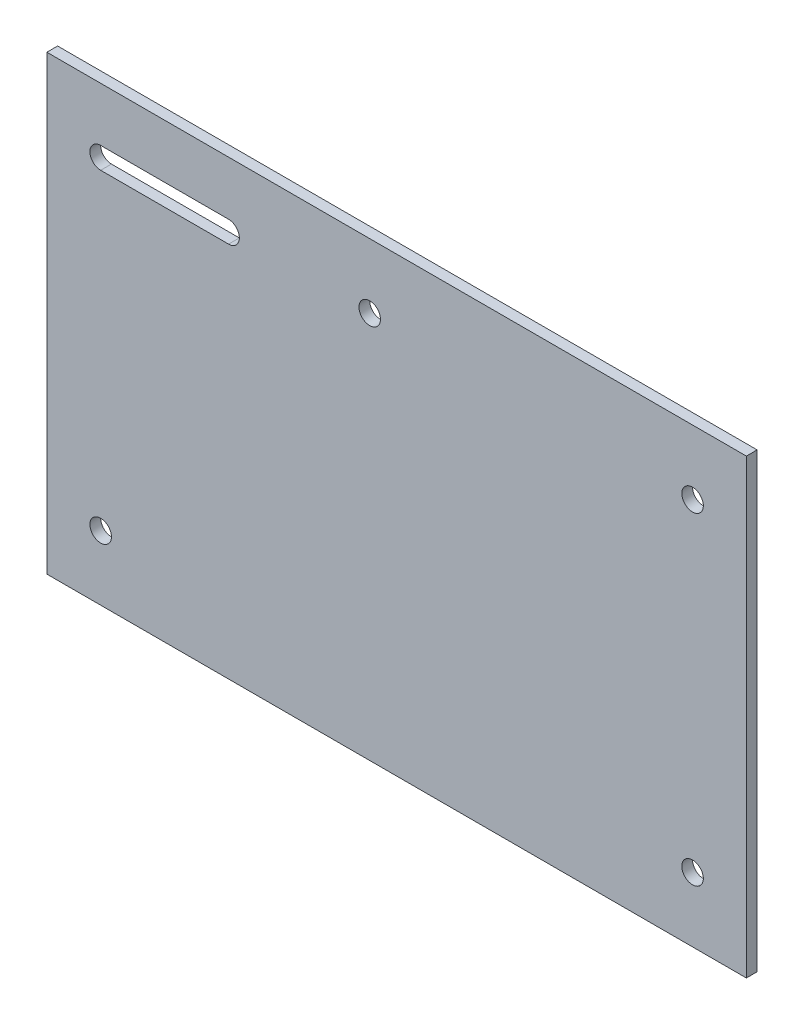
ISO-10303-21;
HEADER;
FILE_DESCRIPTION(('STEP AP214'),'2;1');
FILE_NAME('part.step','',(''),(''),'','','');
FILE_SCHEMA(('AUTOMOTIVE_DESIGN { 1 0 10303 214 1 1 1 1 }'));
ENDSEC;
DATA;
#1=APPLICATION_CONTEXT('core data for automotive mechanical design processes');
#2=APPLICATION_PROTOCOL_DEFINITION('international standard','automotive_design',2000,#1);
#3=PRODUCT_CONTEXT('',#1,'mechanical');
#4=PRODUCT('Part','Part','',(#3));
#5=PRODUCT_RELATED_PRODUCT_CATEGORY('part','',(#4));
#6=PRODUCT_DEFINITION_FORMATION('','',#4);
#7=PRODUCT_DEFINITION_CONTEXT('part definition',#1,'design');
#8=PRODUCT_DEFINITION('design','',#6,#7);
#9=PRODUCT_DEFINITION_SHAPE('','',#8);
#10=(LENGTH_UNIT() NAMED_UNIT(*) SI_UNIT(.MILLI.,.METRE.));
#11=(NAMED_UNIT(*) PLANE_ANGLE_UNIT() SI_UNIT($,.RADIAN.));
#12=(NAMED_UNIT(*) SI_UNIT($,.STERADIAN.) SOLID_ANGLE_UNIT());
#13=UNCERTAINTY_MEASURE_WITH_UNIT(LENGTH_MEASURE(1.E-05),#10,'distance_accuracy_value','');
#14=(GEOMETRIC_REPRESENTATION_CONTEXT(3) GLOBAL_UNCERTAINTY_ASSIGNED_CONTEXT((#13)) GLOBAL_UNIT_ASSIGNED_CONTEXT((#10,
#11,#12)) REPRESENTATION_CONTEXT('',''));
#15=CARTESIAN_POINT('',(0.,0.,0.));
#16=DIRECTION('',(0.,0.,1.));
#17=DIRECTION('',(1.,0.,0.));
#18=AXIS2_PLACEMENT_3D('',#15,#16,#17);
#19=CARTESIAN_POINT('',(65.,-42.,2.));
#20=DIRECTION('',(-1.,0.,0.));
#21=DIRECTION('',(0.,0.,1.));
#22=AXIS2_PLACEMENT_3D('',#19,#20,#21);
#23=PLANE('',#22);
#24=DIRECTION('',(0.,1.,0.));
#25=VECTOR('',#24,1.);
#26=CARTESIAN_POINT('',(65.,-42.,0.));
#27=LINE('',#26,#25);
#28=CARTESIAN_POINT('',(65.,-42.,0.));
#29=VERTEX_POINT('',#28);
#30=CARTESIAN_POINT('',(65.,42.,0.));
#31=VERTEX_POINT('',#30);
#32=EDGE_CURVE('E156',#29,#31,#27,.T.);
#33=ORIENTED_EDGE('',*,*,#32,.T.);
#34=DIRECTION('',(0.,0.,-1.));
#35=VECTOR('',#34,1.);
#36=CARTESIAN_POINT('',(65.,42.,2.));
#37=LINE('',#36,#35);
#38=CARTESIAN_POINT('',(65.,42.,2.));
#39=VERTEX_POINT('',#38);
#40=EDGE_CURVE('E11',#39,#31,#37,.T.);
#41=ORIENTED_EDGE('',*,*,#40,.F.);
#42=DIRECTION('',(0.,1.,0.));
#43=VECTOR('',#42,1.);
#44=CARTESIAN_POINT('',(65.,-42.,2.));
#45=LINE('',#44,#43);
#46=CARTESIAN_POINT('',(65.,-42.,2.));
#47=VERTEX_POINT('',#46);
#48=EDGE_CURVE('E159',#47,#39,#45,.T.);
#49=ORIENTED_EDGE('',*,*,#48,.F.);
#50=DIRECTION('',(0.,0.,-1.));
#51=VECTOR('',#50,1.);
#52=CARTESIAN_POINT('',(65.,-42.,2.));
#53=LINE('',#52,#51);
#54=EDGE_CURVE('E169',#47,#29,#53,.T.);
#55=ORIENTED_EDGE('',*,*,#54,.T.);
#56=EDGE_LOOP('',(#33,#41,#49,#55));
#57=FACE_BOUND('',#56,.T.);
#58=ADVANCED_FACE('F34',(#57),#23,.F.);
#59=CARTESIAN_POINT('',(-65.,42.,2.));
#60=DIRECTION('',(0.,-1.,0.));
#61=DIRECTION('',(0.,0.,-1.));
#62=AXIS2_PLACEMENT_3D('',#59,#60,#61);
#63=PLANE('',#62);
#64=DIRECTION('',(-1.,0.,0.));
#65=VECTOR('',#64,1.);
#66=CARTESIAN_POINT('',(-65.,42.,0.));
#67=LINE('',#66,#65);
#68=CARTESIAN_POINT('',(-65.,42.,0.));
#69=VERTEX_POINT('',#68);
#70=EDGE_CURVE('E172',#31,#69,#67,.T.);
#71=ORIENTED_EDGE('',*,*,#70,.T.);
#72=DIRECTION('',(0.,0.,-1.));
#73=VECTOR('',#72,1.);
#74=CARTESIAN_POINT('',(-65.,42.,2.));
#75=LINE('',#74,#73);
#76=CARTESIAN_POINT('',(-65.,42.,2.));
#77=VERTEX_POINT('',#76);
#78=EDGE_CURVE('E41',#77,#69,#75,.T.);
#79=ORIENTED_EDGE('',*,*,#78,.F.);
#80=DIRECTION('',(-1.,0.,0.));
#81=VECTOR('',#80,1.);
#82=CARTESIAN_POINT('',(-65.,42.,2.));
#83=LINE('',#82,#81);
#84=EDGE_CURVE('E162',#39,#77,#83,.T.);
#85=ORIENTED_EDGE('',*,*,#84,.F.);
#86=ORIENTED_EDGE('',*,*,#40,.T.);
#87=EDGE_LOOP('',(#71,#79,#85,#86));
#88=FACE_BOUND('',#87,.T.);
#89=ADVANCED_FACE('F201',(#88),#63,.F.);
#90=CARTESIAN_POINT('',(-65.,-42.,2.));
#91=DIRECTION('',(1.,0.,0.));
#92=DIRECTION('',(0.,0.,-1.));
#93=AXIS2_PLACEMENT_3D('',#90,#91,#92);
#94=PLANE('',#93);
#95=DIRECTION('',(0.,-1.,0.));
#96=VECTOR('',#95,1.);
#97=CARTESIAN_POINT('',(-65.,-42.,0.));
#98=LINE('',#97,#96);
#99=CARTESIAN_POINT('',(-65.,-42.,0.));
#100=VERTEX_POINT('',#99);
#101=EDGE_CURVE('E174',#69,#100,#98,.T.);
#102=ORIENTED_EDGE('',*,*,#101,.T.);
#103=DIRECTION('',(0.,0.,-1.));
#104=VECTOR('',#103,1.);
#105=CARTESIAN_POINT('',(-65.,-42.,2.));
#106=LINE('',#105,#104);
#107=CARTESIAN_POINT('',(-65.,-42.,2.));
#108=VERTEX_POINT('',#107);
#109=EDGE_CURVE('E179',#108,#100,#106,.T.);
#110=ORIENTED_EDGE('',*,*,#109,.F.);
#111=DIRECTION('',(0.,-1.,0.));
#112=VECTOR('',#111,1.);
#113=CARTESIAN_POINT('',(-65.,-42.,2.));
#114=LINE('',#113,#112);
#115=EDGE_CURVE('E165',#77,#108,#114,.T.);
#116=ORIENTED_EDGE('',*,*,#115,.F.);
#117=ORIENTED_EDGE('',*,*,#78,.T.);
#118=EDGE_LOOP('',(#102,#110,#116,#117));
#119=FACE_BOUND('',#118,.T.);
#120=ADVANCED_FACE('F186',(#119),#94,.F.);
#121=CARTESIAN_POINT('',(-65.,-42.,2.));
#122=DIRECTION('',(0.,1.,0.));
#123=DIRECTION('',(0.,0.,1.));
#124=AXIS2_PLACEMENT_3D('',#121,#122,#123);
#125=PLANE('',#124);
#126=DIRECTION('',(1.,0.,0.));
#127=VECTOR('',#126,1.);
#128=CARTESIAN_POINT('',(-65.,-42.,0.));
#129=LINE('',#128,#127);
#130=EDGE_CURVE('E163',#100,#29,#129,.T.);
#131=ORIENTED_EDGE('',*,*,#130,.T.);
#132=ORIENTED_EDGE('',*,*,#54,.F.);
#133=DIRECTION('',(1.,0.,0.));
#134=VECTOR('',#133,1.);
#135=CARTESIAN_POINT('',(-65.,-42.,2.));
#136=LINE('',#135,#134);
#137=EDGE_CURVE('E167',#108,#47,#136,.T.);
#138=ORIENTED_EDGE('',*,*,#137,.F.);
#139=ORIENTED_EDGE('',*,*,#109,.T.);
#140=EDGE_LOOP('',(#131,#132,#138,#139));
#141=FACE_BOUND('',#140,.T.);
#142=ADVANCED_FACE('F194',(#141),#125,.F.);
#143=CARTESIAN_POINT('',(0.,0.,2.));
#144=DIRECTION('',(0.,0.,-1.));
#145=DIRECTION('',(-1.,0.,0.));
#146=AXIS2_PLACEMENT_3D('',#143,#144,#145);
#147=PLANE('',#146);
#148=DIRECTION('',(1.,0.,0.));
#149=VECTOR('',#148,1.);
#150=CARTESIAN_POINT('',(-55.,28.,2.));
#151=LINE('',#150,#149);
#152=CARTESIAN_POINT('',(-55.,28.,2.));
#153=VERTEX_POINT('',#152);
#154=CARTESIAN_POINT('',(-31.229864945392,28.,2.));
#155=VERTEX_POINT('',#154);
#156=EDGE_CURVE('E125',#153,#155,#151,.T.);
#157=ORIENTED_EDGE('',*,*,#156,.F.);
#158=CARTESIAN_POINT('',(-55.,30.,2.));
#159=DIRECTION('',(0.,0.,1.));
#160=DIRECTION('',(1.,0.,0.));
#161=AXIS2_PLACEMENT_3D('',#158,#159,#160);
#162=CIRCLE('',#161,2.);
#163=CARTESIAN_POINT('',(-55.,32.,2.));
#164=VERTEX_POINT('',#163);
#165=EDGE_CURVE('E48',#164,#153,#162,.T.);
#166=ORIENTED_EDGE('',*,*,#165,.F.);
#167=DIRECTION('',(-1.,0.,0.));
#168=VECTOR('',#167,1.);
#169=CARTESIAN_POINT('',(-55.,32.,2.));
#170=LINE('',#169,#168);
#171=CARTESIAN_POINT('',(-31.229864945392,32.,2.));
#172=VERTEX_POINT('',#171);
#173=EDGE_CURVE('E116',#172,#164,#170,.T.);
#174=ORIENTED_EDGE('',*,*,#173,.F.);
#175=CARTESIAN_POINT('',(-31.229864945392,30.,2.));
#176=DIRECTION('',(0.,0.,1.));
#177=DIRECTION('',(1.,0.,0.));
#178=AXIS2_PLACEMENT_3D('',#175,#176,#177);
#179=CIRCLE('',#178,2.);
#180=EDGE_CURVE('E119',#155,#172,#179,.T.);
#181=ORIENTED_EDGE('',*,*,#180,.F.);
#182=EDGE_LOOP('',(#157,#166,#174,#181));
#183=FACE_BOUND('',#182,.T.);
#184=CARTESIAN_POINT('',(-55.,-30.,2.));
#185=DIRECTION('',(0.,0.,1.));
#186=DIRECTION('',(1.,0.,0.));
#187=AXIS2_PLACEMENT_3D('',#184,#185,#186);
#188=CIRCLE('',#187,2.);
#189=CARTESIAN_POINT('',(-53.,-30.,2.));
#190=VERTEX_POINT('',#189);
#191=EDGE_CURVE('E145',#190,#190,#188,.T.);
#192=ORIENTED_EDGE('',*,*,#191,.F.);
#193=EDGE_LOOP('',(#192));
#194=FACE_BOUND('',#193,.T.);
#195=CARTESIAN_POINT('',(55.,30.,2.));
#196=DIRECTION('',(0.,0.,1.));
#197=DIRECTION('',(1.,0.,0.));
#198=AXIS2_PLACEMENT_3D('',#195,#196,#197);
#199=CIRCLE('',#198,2.);
#200=CARTESIAN_POINT('',(57.,30.,2.));
#201=VERTEX_POINT('',#200);
#202=EDGE_CURVE('E138',#201,#201,#199,.T.);
#203=ORIENTED_EDGE('',*,*,#202,.F.);
#204=EDGE_LOOP('',(#203));
#205=FACE_BOUND('',#204,.T.);
#206=CARTESIAN_POINT('',(-4.99999999999999,30.,2.));
#207=DIRECTION('',(0.,0.,1.));
#208=DIRECTION('',(1.,0.,0.));
#209=AXIS2_PLACEMENT_3D('',#206,#207,#208);
#210=CIRCLE('',#209,2.);
#211=CARTESIAN_POINT('',(-2.99999999999999,30.,2.));
#212=VERTEX_POINT('',#211);
#213=EDGE_CURVE('E131',#212,#212,#210,.T.);
#214=ORIENTED_EDGE('',*,*,#213,.F.);
#215=EDGE_LOOP('',(#214));
#216=FACE_BOUND('',#215,.T.);
#217=CARTESIAN_POINT('',(55.,-30.,2.));
#218=DIRECTION('',(0.,0.,1.));
#219=DIRECTION('',(1.,0.,0.));
#220=AXIS2_PLACEMENT_3D('',#217,#218,#219);
#221=CIRCLE('',#220,2.);
#222=CARTESIAN_POINT('',(57.,-30.,2.));
#223=VERTEX_POINT('',#222);
#224=EDGE_CURVE('E144',#223,#223,#221,.T.);
#225=ORIENTED_EDGE('',*,*,#224,.F.);
#226=EDGE_LOOP('',(#225));
#227=FACE_BOUND('',#226,.T.);
#228=ORIENTED_EDGE('',*,*,#48,.T.);
#229=ORIENTED_EDGE('',*,*,#84,.T.);
#230=ORIENTED_EDGE('',*,*,#115,.T.);
#231=ORIENTED_EDGE('',*,*,#137,.T.);
#232=EDGE_LOOP('',(#228,#229,#230,#231));
#233=FACE_BOUND('',#232,.T.);
#234=ADVANCED_FACE('F200',(#183,#194,#205,#216,#227,#233),#147,.F.);
#235=CARTESIAN_POINT('',(0.,0.,0.));
#236=DIRECTION('',(0.,0.,-1.));
#237=DIRECTION('',(-1.,0.,0.));
#238=AXIS2_PLACEMENT_3D('',#235,#236,#237);
#239=PLANE('',#238);
#240=CARTESIAN_POINT('',(-55.,30.,0.));
#241=DIRECTION('',(0.,0.,1.));
#242=DIRECTION('',(1.,0.,0.));
#243=AXIS2_PLACEMENT_3D('',#240,#241,#242);
#244=CIRCLE('',#243,2.);
#245=CARTESIAN_POINT('',(-55.,32.,0.));
#246=VERTEX_POINT('',#245);
#247=CARTESIAN_POINT('',(-55.,28.,0.));
#248=VERTEX_POINT('',#247);
#249=EDGE_CURVE('E100',#246,#248,#244,.T.);
#250=ORIENTED_EDGE('',*,*,#249,.T.);
#251=DIRECTION('',(1.,0.,0.));
#252=VECTOR('',#251,1.);
#253=CARTESIAN_POINT('',(-55.,28.,0.));
#254=LINE('',#253,#252);
#255=CARTESIAN_POINT('',(-31.229864945392,28.,0.));
#256=VERTEX_POINT('',#255);
#257=EDGE_CURVE('E109',#248,#256,#254,.T.);
#258=ORIENTED_EDGE('',*,*,#257,.T.);
#259=CARTESIAN_POINT('',(-31.229864945392,30.,0.));
#260=DIRECTION('',(0.,0.,1.));
#261=DIRECTION('',(1.,0.,0.));
#262=AXIS2_PLACEMENT_3D('',#259,#260,#261);
#263=CIRCLE('',#262,2.);
#264=CARTESIAN_POINT('',(-31.229864945392,32.,0.));
#265=VERTEX_POINT('',#264);
#266=EDGE_CURVE('E56',#256,#265,#263,.T.);
#267=ORIENTED_EDGE('',*,*,#266,.T.);
#268=DIRECTION('',(-1.,0.,0.));
#269=VECTOR('',#268,1.);
#270=CARTESIAN_POINT('',(-55.,32.,0.));
#271=LINE('',#270,#269);
#272=EDGE_CURVE('E106',#265,#246,#271,.T.);
#273=ORIENTED_EDGE('',*,*,#272,.T.);
#274=EDGE_LOOP('',(#250,#258,#267,#273));
#275=FACE_BOUND('',#274,.T.);
#276=CARTESIAN_POINT('',(-55.,-30.,0.));
#277=DIRECTION('',(0.,0.,1.));
#278=DIRECTION('',(1.,0.,0.));
#279=AXIS2_PLACEMENT_3D('',#276,#277,#278);
#280=CIRCLE('',#279,2.);
#281=CARTESIAN_POINT('',(-53.,-30.,0.));
#282=VERTEX_POINT('',#281);
#283=EDGE_CURVE('E141',#282,#282,#280,.T.);
#284=ORIENTED_EDGE('',*,*,#283,.T.);
#285=EDGE_LOOP('',(#284));
#286=FACE_BOUND('',#285,.T.);
#287=CARTESIAN_POINT('',(55.,30.,0.));
#288=DIRECTION('',(0.,0.,1.));
#289=DIRECTION('',(1.,0.,0.));
#290=AXIS2_PLACEMENT_3D('',#287,#288,#289);
#291=CIRCLE('',#290,2.);
#292=CARTESIAN_POINT('',(57.,30.,0.));
#293=VERTEX_POINT('',#292);
#294=EDGE_CURVE('E148',#293,#293,#291,.T.);
#295=ORIENTED_EDGE('',*,*,#294,.T.);
#296=EDGE_LOOP('',(#295));
#297=FACE_BOUND('',#296,.T.);
#298=CARTESIAN_POINT('',(-4.99999999999999,30.,0.));
#299=DIRECTION('',(0.,0.,1.));
#300=DIRECTION('',(1.,0.,0.));
#301=AXIS2_PLACEMENT_3D('',#298,#299,#300);
#302=CIRCLE('',#301,2.);
#303=CARTESIAN_POINT('',(-2.99999999999999,30.,0.));
#304=VERTEX_POINT('',#303);
#305=EDGE_CURVE('E135',#304,#304,#302,.T.);
#306=ORIENTED_EDGE('',*,*,#305,.T.);
#307=EDGE_LOOP('',(#306));
#308=FACE_BOUND('',#307,.T.);
#309=CARTESIAN_POINT('',(55.,-30.,0.));
#310=DIRECTION('',(0.,0.,1.));
#311=DIRECTION('',(1.,0.,0.));
#312=AXIS2_PLACEMENT_3D('',#309,#310,#311);
#313=CIRCLE('',#312,2.);
#314=CARTESIAN_POINT('',(57.,-30.,0.));
#315=VERTEX_POINT('',#314);
#316=EDGE_CURVE('E153',#315,#315,#313,.T.);
#317=ORIENTED_EDGE('',*,*,#316,.T.);
#318=EDGE_LOOP('',(#317));
#319=FACE_BOUND('',#318,.T.);
#320=ORIENTED_EDGE('',*,*,#32,.F.);
#321=ORIENTED_EDGE('',*,*,#130,.F.);
#322=ORIENTED_EDGE('',*,*,#101,.F.);
#323=ORIENTED_EDGE('',*,*,#70,.F.);
#324=EDGE_LOOP('',(#320,#321,#322,#323));
#325=FACE_BOUND('',#324,.T.);
#326=ADVANCED_FACE('F113',(#275,#286,#297,#308,#319,#325),#239,.T.);
#327=CARTESIAN_POINT('',(55.,-30.,0.));
#328=DIRECTION('',(0.,0.,1.));
#329=DIRECTION('',(1.,0.,0.));
#330=AXIS2_PLACEMENT_3D('',#327,#328,#329);
#331=CYLINDRICAL_SURFACE('',#330,2.);
#332=ORIENTED_EDGE('',*,*,#316,.F.);
#333=EDGE_LOOP('',(#332));
#334=FACE_BOUND('',#333,.T.);
#335=ORIENTED_EDGE('',*,*,#224,.T.);
#336=EDGE_LOOP('',(#335));
#337=FACE_BOUND('',#336,.T.);
#338=ADVANCED_FACE('F213',(#334,#337),#331,.F.);
#339=CARTESIAN_POINT('',(-4.99999999999999,30.,0.));
#340=DIRECTION('',(0.,0.,1.));
#341=DIRECTION('',(1.,0.,0.));
#342=AXIS2_PLACEMENT_3D('',#339,#340,#341);
#343=CYLINDRICAL_SURFACE('',#342,2.);
#344=ORIENTED_EDGE('',*,*,#305,.F.);
#345=EDGE_LOOP('',(#344));
#346=FACE_BOUND('',#345,.T.);
#347=ORIENTED_EDGE('',*,*,#213,.T.);
#348=EDGE_LOOP('',(#347));
#349=FACE_BOUND('',#348,.T.);
#350=ADVANCED_FACE('F219',(#346,#349),#343,.F.);
#351=CARTESIAN_POINT('',(55.,30.,0.));
#352=DIRECTION('',(0.,0.,1.));
#353=DIRECTION('',(1.,0.,0.));
#354=AXIS2_PLACEMENT_3D('',#351,#352,#353);
#355=CYLINDRICAL_SURFACE('',#354,2.);
#356=ORIENTED_EDGE('',*,*,#294,.F.);
#357=EDGE_LOOP('',(#356));
#358=FACE_BOUND('',#357,.T.);
#359=ORIENTED_EDGE('',*,*,#202,.T.);
#360=EDGE_LOOP('',(#359));
#361=FACE_BOUND('',#360,.T.);
#362=ADVANCED_FACE('F221',(#358,#361),#355,.F.);
#363=CARTESIAN_POINT('',(-55.,-30.,0.));
#364=DIRECTION('',(0.,0.,1.));
#365=DIRECTION('',(1.,0.,0.));
#366=AXIS2_PLACEMENT_3D('',#363,#364,#365);
#367=CYLINDRICAL_SURFACE('',#366,2.);
#368=ORIENTED_EDGE('',*,*,#283,.F.);
#369=EDGE_LOOP('',(#368));
#370=FACE_BOUND('',#369,.T.);
#371=ORIENTED_EDGE('',*,*,#191,.T.);
#372=EDGE_LOOP('',(#371));
#373=FACE_BOUND('',#372,.T.);
#374=ADVANCED_FACE('F224',(#370,#373),#367,.F.);
#375=CARTESIAN_POINT('',(-55.,30.,0.));
#376=DIRECTION('',(0.,0.,1.));
#377=DIRECTION('',(1.,0.,0.));
#378=AXIS2_PLACEMENT_3D('',#375,#376,#377);
#379=CYLINDRICAL_SURFACE('',#378,2.);
#380=ORIENTED_EDGE('',*,*,#165,.T.);
#381=DIRECTION('',(0.,0.,1.));
#382=VECTOR('',#381,1.);
#383=CARTESIAN_POINT('',(-55.,28.,0.));
#384=LINE('',#383,#382);
#385=EDGE_CURVE('E96',#248,#153,#384,.T.);
#386=ORIENTED_EDGE('',*,*,#385,.F.);
#387=ORIENTED_EDGE('',*,*,#249,.F.);
#388=DIRECTION('',(0.,0.,1.));
#389=VECTOR('',#388,1.);
#390=CARTESIAN_POINT('',(-55.,32.,0.));
#391=LINE('',#390,#389);
#392=EDGE_CURVE('E129',#246,#164,#391,.T.);
#393=ORIENTED_EDGE('',*,*,#392,.T.);
#394=EDGE_LOOP('',(#380,#386,#387,#393));
#395=FACE_BOUND('',#394,.T.);
#396=ADVANCED_FACE('F98',(#395),#379,.F.);
#397=CARTESIAN_POINT('',(-55.,32.,0.));
#398=DIRECTION('',(0.,1.,0.));
#399=DIRECTION('',(0.,0.,1.));
#400=AXIS2_PLACEMENT_3D('',#397,#398,#399);
#401=PLANE('',#400);
#402=ORIENTED_EDGE('',*,*,#173,.T.);
#403=ORIENTED_EDGE('',*,*,#392,.F.);
#404=ORIENTED_EDGE('',*,*,#272,.F.);
#405=DIRECTION('',(0.,0.,1.));
#406=VECTOR('',#405,1.);
#407=CARTESIAN_POINT('',(-31.229864945392,32.,0.));
#408=LINE('',#407,#406);
#409=EDGE_CURVE('E132',#265,#172,#408,.T.);
#410=ORIENTED_EDGE('',*,*,#409,.T.);
#411=EDGE_LOOP('',(#402,#403,#404,#410));
#412=FACE_BOUND('',#411,.T.);
#413=ADVANCED_FACE('F234',(#412),#401,.F.);
#414=CARTESIAN_POINT('',(-31.229864945392,30.,0.));
#415=DIRECTION('',(0.,0.,1.));
#416=DIRECTION('',(1.,0.,0.));
#417=AXIS2_PLACEMENT_3D('',#414,#415,#416);
#418=CYLINDRICAL_SURFACE('',#417,2.);
#419=ORIENTED_EDGE('',*,*,#180,.T.);
#420=ORIENTED_EDGE('',*,*,#409,.F.);
#421=ORIENTED_EDGE('',*,*,#266,.F.);
#422=DIRECTION('',(0.,0.,1.));
#423=VECTOR('',#422,1.);
#424=CARTESIAN_POINT('',(-31.229864945392,28.,0.));
#425=LINE('',#424,#423);
#426=EDGE_CURVE('E105',#256,#155,#425,.T.);
#427=ORIENTED_EDGE('',*,*,#426,.T.);
#428=EDGE_LOOP('',(#419,#420,#421,#427));
#429=FACE_BOUND('',#428,.T.);
#430=ADVANCED_FACE('F237',(#429),#418,.F.);
#431=CARTESIAN_POINT('',(-55.,28.,0.));
#432=DIRECTION('',(0.,-1.,0.));
#433=DIRECTION('',(0.,0.,-1.));
#434=AXIS2_PLACEMENT_3D('',#431,#432,#433);
#435=PLANE('',#434);
#436=ORIENTED_EDGE('',*,*,#156,.T.);
#437=ORIENTED_EDGE('',*,*,#426,.F.);
#438=ORIENTED_EDGE('',*,*,#257,.F.);
#439=ORIENTED_EDGE('',*,*,#385,.T.);
#440=EDGE_LOOP('',(#436,#437,#438,#439));
#441=FACE_BOUND('',#440,.T.);
#442=ADVANCED_FACE('F110',(#441),#435,.F.);
#443=CLOSED_SHELL('',(#58,#89,#120,#142,#234,#326,#338,#350,#362,#374,#396,#413,#430,#442));
#444=MANIFOLD_SOLID_BREP('B2',#443);
#445=ADVANCED_BREP_SHAPE_REPRESENTATION('',(#18,#444),#14);
#446=SHAPE_DEFINITION_REPRESENTATION(#9,#445);
ENDSEC;
END-ISO-10303-21;
